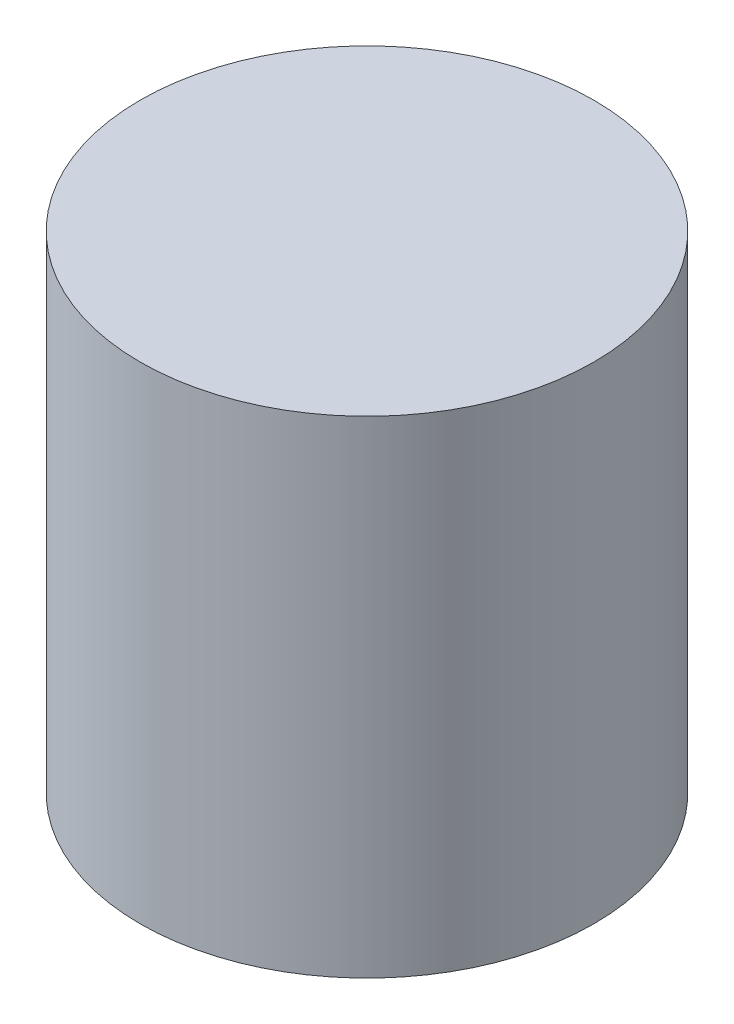
ISO-10303-21;
HEADER;
FILE_DESCRIPTION(('STEP AP214'),'2;1');
FILE_NAME('part.step','',(''),(''),'','','');
FILE_SCHEMA(('AUTOMOTIVE_DESIGN { 1 0 10303 214 1 1 1 1 }'));
ENDSEC;
DATA;
#1=APPLICATION_CONTEXT('core data for automotive mechanical design processes');
#2=APPLICATION_PROTOCOL_DEFINITION('international standard','automotive_design',2000,#1);
#3=PRODUCT_CONTEXT('',#1,'mechanical');
#4=PRODUCT('Part','Part','',(#3));
#5=PRODUCT_RELATED_PRODUCT_CATEGORY('part','',(#4));
#6=PRODUCT_DEFINITION_FORMATION('','',#4);
#7=PRODUCT_DEFINITION_CONTEXT('part definition',#1,'design');
#8=PRODUCT_DEFINITION('design','',#6,#7);
#9=PRODUCT_DEFINITION_SHAPE('','',#8);
#10=(LENGTH_UNIT() NAMED_UNIT(*) SI_UNIT(.MILLI.,.METRE.));
#11=(NAMED_UNIT(*) PLANE_ANGLE_UNIT() SI_UNIT($,.RADIAN.));
#12=(NAMED_UNIT(*) SI_UNIT($,.STERADIAN.) SOLID_ANGLE_UNIT());
#13=UNCERTAINTY_MEASURE_WITH_UNIT(LENGTH_MEASURE(1.E-05),#10,'distance_accuracy_value','');
#14=(GEOMETRIC_REPRESENTATION_CONTEXT(3) GLOBAL_UNCERTAINTY_ASSIGNED_CONTEXT((#13)) GLOBAL_UNIT_ASSIGNED_CONTEXT((#10,
#11,#12)) REPRESENTATION_CONTEXT('',''));
#15=CARTESIAN_POINT('',(0.,0.,0.));
#16=DIRECTION('',(0.,0.,1.));
#17=DIRECTION('',(1.,0.,0.));
#18=AXIS2_PLACEMENT_3D('',#15,#16,#17);
#19=CARTESIAN_POINT('',(0.,254.479731009648,0.));
#20=DIRECTION('',(0.,1.,0.));
#21=DIRECTION('',(0.,0.,1.));
#22=AXIS2_PLACEMENT_3D('',#19,#20,#21);
#23=PLANE('',#22);
#24=CARTESIAN_POINT('',(0.,254.479731009648,0.));
#25=DIRECTION('',(0.,-1.,0.));
#26=DIRECTION('',(0.,0.,-1.));
#27=AXIS2_PLACEMENT_3D('',#24,#25,#26);
#28=CIRCLE('',#27,25.4);
#29=CARTESIAN_POINT('',(0.,254.479731009648,-25.4));
#30=VERTEX_POINT('',#29);
#31=EDGE_CURVE('E10',#30,#30,#28,.T.);
#32=ORIENTED_EDGE('',*,*,#31,.F.);
#33=EDGE_LOOP('',(#32));
#34=FACE_BOUND('',#33,.T.);
#35=ADVANCED_FACE('F31',(#34),#23,.T.);
#36=CARTESIAN_POINT('',(0.,200.,0.));
#37=DIRECTION('',(0.,-1.,0.));
#38=DIRECTION('',(0.,0.,-1.));
#39=AXIS2_PLACEMENT_3D('',#36,#37,#38);
#40=CYLINDRICAL_SURFACE('',#39,25.4);
#41=ORIENTED_EDGE('',*,*,#31,.T.);
#42=EDGE_LOOP('',(#41));
#43=FACE_BOUND('',#42,.T.);
#44=CARTESIAN_POINT('',(0.,200.,0.));
#45=DIRECTION('',(0.,-1.,0.));
#46=DIRECTION('',(0.,0.,-1.));
#47=AXIS2_PLACEMENT_3D('',#44,#45,#46);
#48=CIRCLE('',#47,25.4);
#49=CARTESIAN_POINT('',(0.,200.,-25.4));
#50=VERTEX_POINT('',#49);
#51=EDGE_CURVE('E37',#50,#50,#48,.T.);
#52=ORIENTED_EDGE('',*,*,#51,.F.);
#53=EDGE_LOOP('',(#52));
#54=FACE_BOUND('',#53,.T.);
#55=ADVANCED_FACE('F45',(#43,#54),#40,.T.);
#56=CARTESIAN_POINT('',(0.,200.,0.));
#57=DIRECTION('',(0.,-1.,0.));
#58=DIRECTION('',(0.,0.,-1.));
#59=AXIS2_PLACEMENT_3D('',#56,#57,#58);
#60=PLANE('',#59);
#61=ORIENTED_EDGE('',*,*,#51,.T.);
#62=EDGE_LOOP('',(#61));
#63=FACE_BOUND('',#62,.T.);
#64=ADVANCED_FACE('F43',(#63),#60,.T.);
#65=CLOSED_SHELL('',(#35,#55,#64));
#66=MANIFOLD_SOLID_BREP('B2',#65);
#67=ADVANCED_BREP_SHAPE_REPRESENTATION('',(#18,#66),#14);
#68=SHAPE_DEFINITION_REPRESENTATION(#9,#67);
ENDSEC;
END-ISO-10303-21;
